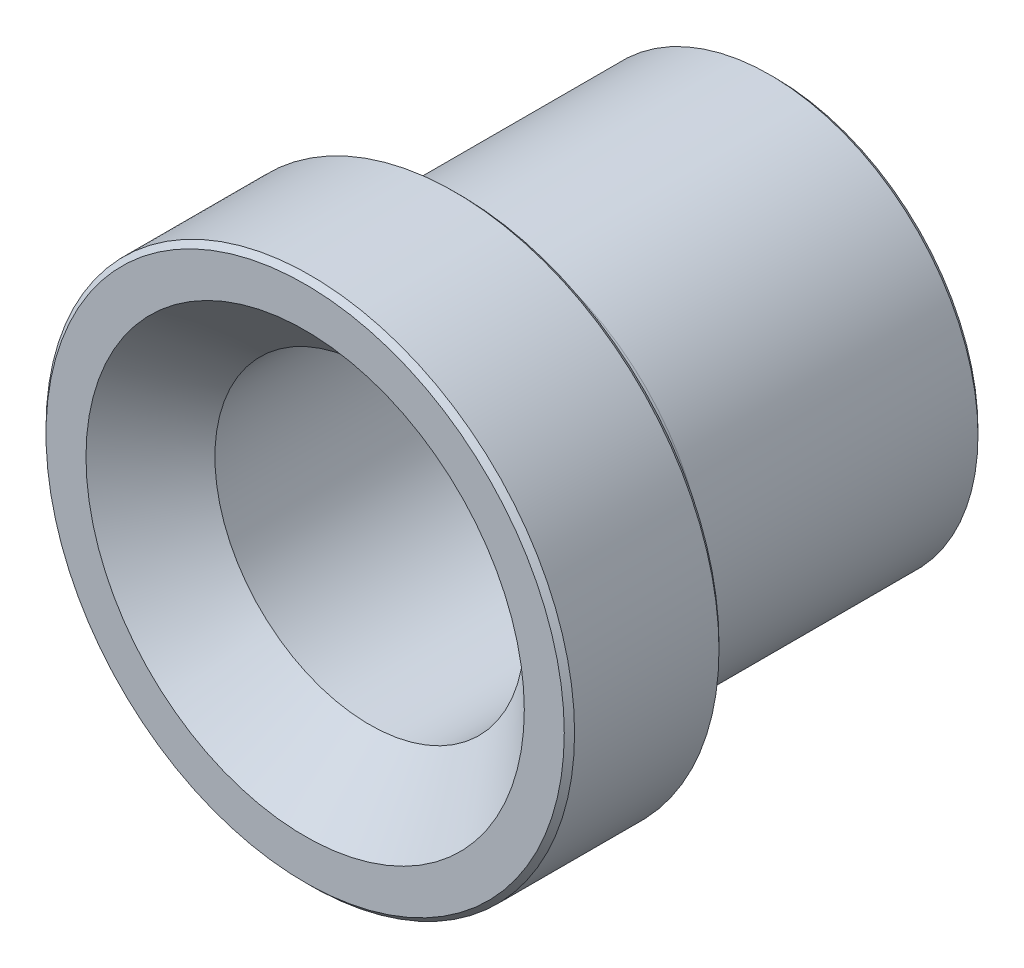
ISO-10303-21;
HEADER;
FILE_DESCRIPTION(('STEP AP214'),'2;1');
FILE_NAME('part.step','',(''),(''),'','','');
FILE_SCHEMA(('AUTOMOTIVE_DESIGN { 1 0 10303 214 1 1 1 1 }'));
ENDSEC;
DATA;
#1=APPLICATION_CONTEXT('core data for automotive mechanical design processes');
#2=APPLICATION_PROTOCOL_DEFINITION('international standard','automotive_design',2000,#1);
#3=PRODUCT_CONTEXT('',#1,'mechanical');
#4=PRODUCT('Part','Part','',(#3));
#5=PRODUCT_RELATED_PRODUCT_CATEGORY('part','',(#4));
#6=PRODUCT_DEFINITION_FORMATION('','',#4);
#7=PRODUCT_DEFINITION_CONTEXT('part definition',#1,'design');
#8=PRODUCT_DEFINITION('design','',#6,#7);
#9=PRODUCT_DEFINITION_SHAPE('','',#8);
#10=(LENGTH_UNIT() NAMED_UNIT(*) SI_UNIT(.MILLI.,.METRE.));
#11=(NAMED_UNIT(*) PLANE_ANGLE_UNIT() SI_UNIT($,.RADIAN.));
#12=(NAMED_UNIT(*) SI_UNIT($,.STERADIAN.) SOLID_ANGLE_UNIT());
#13=UNCERTAINTY_MEASURE_WITH_UNIT(LENGTH_MEASURE(1.E-05),#10,'distance_accuracy_value','');
#14=(GEOMETRIC_REPRESENTATION_CONTEXT(3) GLOBAL_UNCERTAINTY_ASSIGNED_CONTEXT((#13)) GLOBAL_UNIT_ASSIGNED_CONTEXT((#10,
#11,#12)) REPRESENTATION_CONTEXT('',''));
#15=CARTESIAN_POINT('',(0.,0.,0.));
#16=DIRECTION('',(0.,0.,1.));
#17=DIRECTION('',(1.,0.,0.));
#18=AXIS2_PLACEMENT_3D('',#15,#16,#17);
#19=CARTESIAN_POINT('',(0.,0.,0.));
#20=DIRECTION('',(0.,0.,1.));
#21=DIRECTION('',(1.,0.,0.));
#22=AXIS2_PLACEMENT_3D('',#19,#20,#21);
#23=CONICAL_SURFACE('',#22,8.49999999999997,0.785398163397443);
#24=CARTESIAN_POINT('',(0.,0.,-2.5));
#25=DIRECTION('',(0.,0.,1.));
#26=DIRECTION('',(1.,0.,0.));
#27=AXIS2_PLACEMENT_3D('',#24,#25,#26);
#28=CIRCLE('',#27,6.);
#29=CARTESIAN_POINT('',(6.,0.,-2.5));
#30=VERTEX_POINT('',#29);
#31=EDGE_CURVE('E121',#30,#30,#28,.T.);
#32=ORIENTED_EDGE('',*,*,#31,.F.);
#33=EDGE_LOOP('',(#32));
#34=FACE_BOUND('',#33,.T.);
#35=CARTESIAN_POINT('',(0.,0.,0.));
#36=DIRECTION('',(0.,0.,1.));
#37=DIRECTION('',(1.,0.,0.));
#38=AXIS2_PLACEMENT_3D('',#35,#36,#37);
#39=CIRCLE('',#38,8.49999999999997);
#40=CARTESIAN_POINT('',(8.49999999999997,0.,0.));
#41=VERTEX_POINT('',#40);
#42=EDGE_CURVE('E192',#41,#41,#39,.T.);
#43=ORIENTED_EDGE('',*,*,#42,.T.);
#44=EDGE_LOOP('',(#43));
#45=FACE_BOUND('',#44,.T.);
#46=ADVANCED_FACE('F33',(#34,#45),#23,.F.);
#47=CARTESIAN_POINT('',(0.,0.,0.));
#48=DIRECTION('',(0.,0.,1.));
#49=DIRECTION('',(1.,0.,0.));
#50=AXIS2_PLACEMENT_3D('',#47,#48,#49);
#51=CYLINDRICAL_SURFACE('',#50,6.);
#52=CARTESIAN_POINT('',(0.,0.,-18.03));
#53=DIRECTION('',(0.,0.,1.));
#54=DIRECTION('',(1.,0.,0.));
#55=AXIS2_PLACEMENT_3D('',#52,#53,#54);
#56=CIRCLE('',#55,6.);
#57=CARTESIAN_POINT('',(2.5,-5.45435605731786,-18.03));
#58=VERTEX_POINT('',#57);
#59=CARTESIAN_POINT('',(-2.5,-5.45435605731786,-18.03));
#60=VERTEX_POINT('',#59);
#61=EDGE_CURVE('E113',#58,#60,#56,.T.);
#62=ORIENTED_EDGE('',*,*,#61,.F.);
#63=DIRECTION('',(0.,0.,1.));
#64=VECTOR('',#63,1.);
#65=CARTESIAN_POINT('',(2.5,-5.45435605731786,0.));
#66=LINE('',#65,#64);
#67=CARTESIAN_POINT('',(2.5,-5.45435605731786,-13.23));
#68=VERTEX_POINT('',#67);
#69=EDGE_CURVE('E55',#58,#68,#66,.T.);
#70=ORIENTED_EDGE('',*,*,#69,.T.);
#71=CARTESIAN_POINT('',(0.,0.,-13.23));
#72=DIRECTION('',(0.,0.,1.));
#73=DIRECTION('',(1.,0.,0.));
#74=AXIS2_PLACEMENT_3D('',#71,#72,#73);
#75=CIRCLE('',#74,6.);
#76=CARTESIAN_POINT('',(-2.5,-5.45435605731786,-13.23));
#77=VERTEX_POINT('',#76);
#78=EDGE_CURVE('E131',#68,#77,#75,.F.);
#79=ORIENTED_EDGE('',*,*,#78,.T.);
#80=DIRECTION('',(0.,0.,1.));
#81=VECTOR('',#80,1.);
#82=CARTESIAN_POINT('',(-2.5,-5.45435605731786,0.));
#83=LINE('',#82,#81);
#84=EDGE_CURVE('E335',#77,#60,#83,.F.);
#85=ORIENTED_EDGE('',*,*,#84,.T.);
#86=EDGE_LOOP('',(#62,#70,#79,#85));
#87=FACE_BOUND('',#86,.T.);
#88=ORIENTED_EDGE('',*,*,#31,.T.);
#89=EDGE_LOOP('',(#88));
#90=FACE_BOUND('',#89,.T.);
#91=ADVANCED_FACE('F176',(#87,#90),#51,.F.);
#92=CARTESIAN_POINT('',(0.,0.,-18.03));
#93=DIRECTION('',(0.,0.,-1.));
#94=DIRECTION('',(-1.,0.,0.));
#95=AXIS2_PLACEMENT_3D('',#92,#93,#94);
#96=CONICAL_SURFACE('',#95,6.,0.78539816339745);
#97=CARTESIAN_POINT('',(0.,0.,-18.23));
#98=DIRECTION('',(0.,0.,1.));
#99=DIRECTION('',(1.,0.,0.));
#100=AXIS2_PLACEMENT_3D('',#97,#98,#99);
#101=CIRCLE('',#100,6.2);
#102=CARTESIAN_POINT('',(2.5,-5.67362318100171,-18.23));
#103=VERTEX_POINT('',#102);
#104=CARTESIAN_POINT('',(-2.5,-5.67362318100171,-18.23));
#105=VERTEX_POINT('',#104);
#106=EDGE_CURVE('E105',#103,#105,#101,.T.);
#107=ORIENTED_EDGE('',*,*,#106,.F.);
#108=CARTESIAN_POINT('',(2.5,-9.60201867180764,-21.952134980625));
#109=CARTESIAN_POINT('',(2.5,-9.38178344013781,-21.7390176101832));
#110=CARTESIAN_POINT('',(2.5,-9.16132708595419,-21.5261279769551));
#111=CARTESIAN_POINT('',(2.5,-8.71983797789744,-21.1009413673837));
#112=CARTESIAN_POINT('',(2.5,-8.49880521627898,-20.8886443990843));
#113=CARTESIAN_POINT('',(2.5,-8.05591560370238,-20.4646716923838));
#114=CARTESIAN_POINT('',(2.5,-7.83405837237561,-20.2529963510818));
#115=CARTESIAN_POINT('',(2.5,-7.38945123177838,-19.8305876633484));
#116=CARTESIAN_POINT('',(2.5,-7.16670132870748,-19.6198543103964));
#117=CARTESIAN_POINT('',(2.5,-6.72491880861437,-19.2041934915301));
#118=CARTESIAN_POINT('',(2.5,-6.50591105061917,-18.9992396266231));
#119=CARTESIAN_POINT('',(2.5,-6.06645173358816,-18.5908862403918));
#120=CARTESIAN_POINT('',(2.5,-5.84600018449974,-18.3874867083795));
#121=CARTESIAN_POINT('',(2.5,-5.4032032732409,-17.9828576587131));
#122=CARTESIAN_POINT('',(2.5,-5.18085835060763,-17.7816276607373));
#123=CARTESIAN_POINT('',(2.5,-4.73349173766885,-17.3821706835744));
#124=CARTESIAN_POINT('',(2.5,-4.50847016384468,-17.1839435745561));
#125=CARTESIAN_POINT('',(2.5,-4.14539278370891,-16.8704143312728));
#126=CARTESIAN_POINT('',(2.5,-4.00857749722596,-16.753677550874));
#127=CARTESIAN_POINT('',(2.5,-3.73315237186513,-16.5223075487719));
#128=CARTESIAN_POINT('',(2.5,-3.59454235935174,-16.4076745332358));
#129=CARTESIAN_POINT('',(2.5,-3.31344710953752,-16.1799463167894));
#130=CARTESIAN_POINT('',(2.5,-3.17093577292817,-16.066883177379));
#131=CARTESIAN_POINT('',(2.5,-2.88286131021967,-15.8447700960094));
#132=CARTESIAN_POINT('',(2.5,-2.73729891217652,-15.7357192133642));
#133=CARTESIAN_POINT('',(2.5,-2.43972307700173,-15.5216103031246));
#134=CARTESIAN_POINT('',(2.5,-2.28764425138712,-15.4166417914498));
#135=CARTESIAN_POINT('',(2.5,-2.05509848851296,-15.2657351168571));
#136=CARTESIAN_POINT('',(2.5,-1.97678260345741,-15.216488117703));
#137=CARTESIAN_POINT('',(2.5,-1.81847720816471,-15.1207721955223));
#138=CARTESIAN_POINT('',(2.5,-1.73848789448753,-15.0743029486684));
#139=CARTESIAN_POINT('',(2.5,-1.57766156326313,-14.9854342304328));
#140=CARTESIAN_POINT('',(2.5,-1.49685058423034,-14.9429882706989));
#141=CARTESIAN_POINT('',(2.5,-1.33314685448077,-14.8623477070864));
#142=CARTESIAN_POINT('',(2.5,-1.25025373392203,-14.8241538651325));
#143=CARTESIAN_POINT('',(2.5,-0.998559756703421,-14.7177704753816));
#144=CARTESIAN_POINT('',(2.5,-0.826135699052493,-14.6574250215428));
#145=CARTESIAN_POINT('',(2.5,-0.567515720782905,-14.5923694220285));
#146=CARTESIAN_POINT('',(2.5,-0.484428053203151,-14.5751566599229));
#147=CARTESIAN_POINT('',(2.5,-0.316968107841335,-14.5486596680996));
#148=CARTESIAN_POINT('',(2.5,-0.232595933495816,-14.5393748033792));
#149=CARTESIAN_POINT('',(2.5,-0.0635545293498249,-14.5293880219311));
#150=CARTESIAN_POINT('',(2.5,0.0211133903774137,-14.528664232716));
#151=CARTESIAN_POINT('',(2.5,0.190087555037353,-14.5357943632657));
#152=CARTESIAN_POINT('',(2.5,0.27439377056234,-14.5436489676941));
#153=CARTESIAN_POINT('',(2.5,0.440806929168448,-14.5672431504869));
#154=CARTESIAN_POINT('',(2.5,0.522928178726345,-14.5828838636708));
#155=CARTESIAN_POINT('',(2.5,0.685529631146964,-14.6210805876454));
#156=CARTESIAN_POINT('',(2.5,0.766009641930485,-14.6436374029513));
#157=CARTESIAN_POINT('',(2.5,0.926069634724629,-14.6949164939594));
#158=CARTESIAN_POINT('',(2.5,1.0056256828142,-14.7237125219922));
#159=CARTESIAN_POINT('',(2.5,1.16274051512552,-14.7862243540705));
#160=CARTESIAN_POINT('',(2.5,1.24029964456728,-14.8199393009411));
#161=CARTESIAN_POINT('',(2.5,1.43120252182423,-14.908905371106));
#162=CARTESIAN_POINT('',(2.5,1.54340353730981,-14.9665984386099));
#163=CARTESIAN_POINT('',(2.5,1.76426358278963,-15.0884546700202));
#164=CARTESIAN_POINT('',(2.5,1.87292033468577,-15.1526218908616));
#165=CARTESIAN_POINT('',(2.5,2.08762998650616,-15.2859327102484));
#166=CARTESIAN_POINT('',(2.5,2.19367271981472,-15.3550925646662));
#167=CARTESIAN_POINT('',(2.5,2.40329683493631,-15.4969711190836));
#168=CARTESIAN_POINT('',(2.5,2.50687879403119,-15.5696889719044));
#169=CARTESIAN_POINT('',(2.5,2.70530044646612,-15.7129691071883));
#170=CARTESIAN_POINT('',(2.5,2.80026630681598,-15.7833574732081));
#171=CARTESIAN_POINT('',(2.5,2.98877666007147,-15.9260227939486));
#172=CARTESIAN_POINT('',(2.5,3.08232104094107,-15.9982998963245));
#173=CARTESIAN_POINT('',(2.5,3.26747276809047,-16.143771702127));
#174=CARTESIAN_POINT('',(2.5,3.35908965284987,-16.2169542999138));
#175=CARTESIAN_POINT('',(2.5,3.54131705134436,-16.3645251877744));
#176=CARTESIAN_POINT('',(2.5,3.63192776727352,-16.4389132279398));
#177=CARTESIAN_POINT('',(2.5,3.722134980625,-16.5137806384782));
#178=B_SPLINE_CURVE_WITH_KNOTS('',3,(#108,#109,#110,#111,#112,#113,#114,#115,#116,#117,#118,
#119,#120,#121,#122,#123,#124,#125,#126,#127,#128,#129,#130,#131,#132,#133,#134,#135,#136,#137,
#138,#139,#140,#141,#142,#143,#144,#145,#146,#147,#148,#149,#150,#151,#152,#153,#154,#155,#156,
#157,#158,#159,#160,#161,#162,#163,#164,#165,#166,#167,#168,#169,#170,#171,#172,#173,#174,#175,
#176,#177),.UNSPECIFIED.,.F.,.F.,(4,2,2,2,2,2,2,2,2,2,2,2,2,2,2,2,2,2,2,2,2,2,2,2,2,2,2,2,2,2,2,
2,2,2,4),(0.,0.919404326288802,1.8388210711597,2.7587340082391,3.67864056760311,
4.57848761028734,5.47832845973746,6.3779658207482,7.27756417392985,7.8170973391364,
8.35668309883595,8.90237227991235,9.44793269647305,10.0020545968718,10.2795480269275,
10.5570090437583,10.8307228185219,11.1044855605964,11.6499085198415,11.9041518155781,
12.1583747452171,12.4119480260451,12.6655415466819,12.9159941554326,13.1664759091292,
13.4200980130424,13.6736759732214,14.0518545157696,14.4302715279117,14.809981657624,
15.1896018121222,15.5441963788214,15.8988187499609,16.250580414396,16.6022700627391),.UNSPECIFIED.);
#179=EDGE_CURVE('E167',#103,#58,#178,.T.);
#180=ORIENTED_EDGE('',*,*,#179,.T.);
#181=ORIENTED_EDGE('',*,*,#61,.T.);
#182=CARTESIAN_POINT('',(-2.5,3.722134980625,-16.5137806384782));
#183=CARTESIAN_POINT('',(-2.5,3.65848993931883,-16.4609491345056));
#184=CARTESIAN_POINT('',(-2.5,3.59464051605015,-16.4083640576587));
#185=CARTESIAN_POINT('',(-2.5,3.46647350947901,-16.3037646561941));
#186=CARTESIAN_POINT('',(-2.5,3.4021559150451,-16.2517503452213));
#187=CARTESIAN_POINT('',(-2.5,3.20828908638222,-16.0965823247877));
#188=CARTESIAN_POINT('',(-2.5,3.07795099612,-15.994407950408));
#189=CARTESIAN_POINT('',(-2.5,2.81160467899573,-15.7913193312205));
#190=CARTESIAN_POINT('',(-2.5,2.67553487016269,-15.6904855244798));
#191=CARTESIAN_POINT('',(-2.5,2.39973748707489,-15.4940067049654));
#192=CARTESIAN_POINT('',(-2.5,2.26001138657893,-15.3983596478886));
#193=CARTESIAN_POINT('',(-2.5,2.01687142405552,-15.2412085175084));
#194=CARTESIAN_POINT('',(-2.5,1.91466736191286,-15.1778418350115));
#195=CARTESIAN_POINT('',(-2.5,1.70729014831226,-15.0561824770022));
#196=CARTESIAN_POINT('',(-2.5,1.60211786265328,-14.9978883417317));
#197=CARTESIAN_POINT('',(-2.5,1.38878604120381,-14.8883888546538));
#198=CARTESIAN_POINT('',(-2.5,1.28064456052844,-14.8371487310442));
#199=CARTESIAN_POINT('',(-2.5,1.06048322475904,-14.7438003964576));
#200=CARTESIAN_POINT('',(-2.5,0.948466381802272,-14.7016852700974));
#201=CARTESIAN_POINT('',(-2.5,0.761527110027135,-14.6424954328919));
#202=CARTESIAN_POINT('',(-2.5,0.687734045698106,-14.6218601834108));
#203=CARTESIAN_POINT('',(-2.5,0.538780548102494,-14.5863762178713));
#204=CARTESIAN_POINT('',(-2.5,0.4636207192134,-14.5715250062743));
#205=CARTESIAN_POINT('',(-2.5,0.312549886268916,-14.548360438496));
#206=CARTESIAN_POINT('',(-2.5,0.236642342967694,-14.5400248323182));
#207=CARTESIAN_POINT('',(-2.5,0.0843791360589929,-14.5302700481991));
#208=CARTESIAN_POINT('',(-2.5,0.00802348862828913,-14.5288506220994));
#209=CARTESIAN_POINT('',(-2.5,-0.144590032888433,-14.5330140710885));
#210=CARTESIAN_POINT('',(-2.5,-0.220847661800396,-14.5386057896037));
#211=CARTESIAN_POINT('',(-2.5,-0.372566251731125,-14.5564850806912));
#212=CARTESIAN_POINT('',(-2.5,-0.448027151643238,-14.5687731631054));
#213=CARTESIAN_POINT('',(-2.5,-0.597981156660188,-14.5994685357518));
#214=CARTESIAN_POINT('',(-2.5,-0.672469407864158,-14.6178992392361));
#215=CARTESIAN_POINT('',(-2.5,-0.819905552636732,-14.6600680873935));
#216=CARTESIAN_POINT('',(-2.5,-0.892853377259965,-14.6838064690754));
#217=CARTESIAN_POINT('',(-2.5,-1.13387656236154,-14.770579898383));
#218=CARTESIAN_POINT('',(-2.5,-1.29836699505776,-14.8436307023741));
#219=CARTESIAN_POINT('',(-2.5,-1.53902693014698,-14.9649314139596));
#220=CARTESIAN_POINT('',(-2.5,-1.61832655652085,-15.0073775616382));
#221=CARTESIAN_POINT('',(-2.5,-1.77514853504791,-15.0954424090945));
#222=CARTESIAN_POINT('',(-2.5,-1.85267119392129,-15.1410605557902));
#223=CARTESIAN_POINT('',(-2.5,-2.00725096664921,-15.2355048389876));
#224=CARTESIAN_POINT('',(-2.5,-2.08428547142144,-15.2843675915175));
#225=CARTESIAN_POINT('',(-2.5,-2.23697196029238,-15.384207579464));
#226=CARTESIAN_POINT('',(-2.5,-2.31262390663195,-15.4351848725069));
#227=CARTESIAN_POINT('',(-2.5,-2.46265425662106,-15.5388068496912));
#228=CARTESIAN_POINT('',(-2.5,-2.537033928538,-15.5914497038316));
#229=CARTESIAN_POINT('',(-2.5,-2.68476248024451,-15.6981531712497));
#230=CARTESIAN_POINT('',(-2.5,-2.75811139691628,-15.7522137336));
#231=CARTESIAN_POINT('',(-2.5,-2.9925756982025,-15.9279499903612));
#232=CARTESIAN_POINT('',(-2.5,-3.15197208859971,-16.0519191377602));
#233=CARTESIAN_POINT('',(-2.5,-3.4676233678881,-16.3038053037576));
#234=CARTESIAN_POINT('',(-2.5,-3.62387779896014,-16.4317228909025));
#235=CARTESIAN_POINT('',(-2.5,-3.93408636358336,-16.6904414358777));
#236=CARTESIAN_POINT('',(-2.5,-4.08803950625923,-16.8212435789472));
#237=CARTESIAN_POINT('',(-2.5,-4.39414275823491,-17.0849443111645));
#238=CARTESIAN_POINT('',(-2.5,-4.54629281052991,-17.2178429662857));
#239=CARTESIAN_POINT('',(-2.5,-4.84950026874218,-17.4855083655877));
#240=CARTESIAN_POINT('',(-2.5,-5.00055475536371,-17.6202784115143));
#241=CARTESIAN_POINT('',(-2.5,-5.30154416095175,-17.8910639587791));
#242=CARTESIAN_POINT('',(-2.5,-5.45147906933453,-18.0270794718641));
#243=CARTESIAN_POINT('',(-2.5,-5.8998657770775,-18.4365174455164));
#244=CARTESIAN_POINT('',(-2.5,-6.19698062130841,-18.711403442285));
#245=CARTESIAN_POINT('',(-2.5,-6.75511500656349,-19.2322779234912));
#246=CARTESIAN_POINT('',(-2.5,-7.01639158045146,-19.4779920129401));
#247=CARTESIAN_POINT('',(-2.5,-7.53758016008937,-19.9709031202078));
#248=CARTESIAN_POINT('',(-2.5,-7.79749205822686,-20.2181002517751));
#249=CARTESIAN_POINT('',(-2.5,-8.31530185205489,-20.7126474379361));
#250=CARTESIAN_POINT('',(-2.5,-8.57320364607079,-20.9599934156622));
#251=CARTESIAN_POINT('',(-2.5,-9.08817449756922,-21.4555037963273));
#252=CARTESIAN_POINT('',(-2.5,-9.34524362925946,-21.7036681221209));
#253=CARTESIAN_POINT('',(-2.5,-9.60201867180764,-21.952134980625));
#254=B_SPLINE_CURVE_WITH_KNOTS('',3,(#182,#183,#184,#185,#186,#187,#188,#189,#190,#191,#192,
#193,#194,#195,#196,#197,#198,#199,#200,#201,#202,#203,#204,#205,#206,#207,#208,#209,#210,#211,
#212,#213,#214,#215,#216,#217,#218,#219,#220,#221,#222,#223,#224,#225,#226,#227,#228,#229,#230,
#231,#232,#233,#234,#235,#236,#237,#238,#239,#240,#241,#242,#243,#244,#245,#246,#247,#248,#249,
#250,#251,#252,#253),.UNSPECIFIED.,.F.,.F.,(4,2,2,2,2,2,2,2,2,2,2,2,2,2,2,2,2,2,2,2,2,2,2,2,2,2,
2,2,2,2,2,2,2,2,2,4),(0.,0.248145226863179,0.496296373134759,0.993087658807286,1.50108719297573,
2.00888502703471,2.36954210005639,2.73009503894445,3.08880164817186,3.44723545314548,
3.67691367800884,3.90649269751843,4.13528426543548,4.36406762406022,4.59313984644889,
4.82222951217456,5.05220255887005,5.28218587682064,5.82050877985799,6.09032403710168,
6.36009236571004,6.63372834420746,6.90737178486163,7.18072434847323,7.45406710602758,
8.05975001834081,8.66552055519226,9.27154481483483,9.8775881831273,10.4848880203154,
11.0921935912492,12.3064792969289,13.3824698210326,14.4585439557946,15.5305682543362,
16.6024942285322),.UNSPECIFIED.);
#255=EDGE_CURVE('E95',#60,#105,#254,.T.);
#256=ORIENTED_EDGE('',*,*,#255,.T.);
#257=EDGE_LOOP('',(#107,#180,#181,#256));
#258=FACE_BOUND('',#257,.T.);
#259=ADVANCED_FACE('F173',(#258),#96,.F.);
#260=CARTESIAN_POINT('',(0.,7.865,-18.23));
#261=DIRECTION('',(0.,0.,1.));
#262=DIRECTION('',(1.,0.,0.));
#263=AXIS2_PLACEMENT_3D('',#260,#261,#262);
#264=PLANE('',#263);
#265=CARTESIAN_POINT('',(0.,0.,-18.23));
#266=DIRECTION('',(0.,0.,1.));
#267=DIRECTION('',(1.,0.,0.));
#268=AXIS2_PLACEMENT_3D('',#265,#266,#267);
#269=CIRCLE('',#268,7.865);
#270=CARTESIAN_POINT('',(2.5,-7.45709226173312,-18.23));
#271=VERTEX_POINT('',#270);
#272=CARTESIAN_POINT('',(-2.5,-7.45709226173312,-18.23));
#273=VERTEX_POINT('',#272);
#274=EDGE_CURVE('E103',#271,#273,#269,.T.);
#275=ORIENTED_EDGE('',*,*,#274,.F.);
#276=DIRECTION('',(0.,1.,0.));
#277=VECTOR('',#276,1.);
#278=CARTESIAN_POINT('',(2.5,-10.25,-18.23));
#279=LINE('',#278,#277);
#280=EDGE_CURVE('E106',#271,#103,#279,.T.);
#281=ORIENTED_EDGE('',*,*,#280,.T.);
#282=ORIENTED_EDGE('',*,*,#106,.T.);
#283=DIRECTION('',(0.,1.,0.));
#284=VECTOR('',#283,1.);
#285=CARTESIAN_POINT('',(-2.5,-10.25,-18.23));
#286=LINE('',#285,#284);
#287=EDGE_CURVE('E87',#273,#105,#286,.T.);
#288=ORIENTED_EDGE('',*,*,#287,.F.);
#289=EDGE_LOOP('',(#275,#281,#282,#288));
#290=FACE_BOUND('',#289,.T.);
#291=ADVANCED_FACE('F101',(#290),#264,.F.);
#292=CARTESIAN_POINT('',(0.,0.,-18.23));
#293=DIRECTION('',(0.,0.,1.));
#294=DIRECTION('',(1.,0.,0.));
#295=AXIS2_PLACEMENT_3D('',#292,#293,#294);
#296=CONICAL_SURFACE('',#295,7.865,0.785398163397461);
#297=CARTESIAN_POINT('',(0.,0.,-18.03));
#298=DIRECTION('',(0.,0.,1.));
#299=DIRECTION('',(1.,0.,0.));
#300=AXIS2_PLACEMENT_3D('',#297,#298,#299);
#301=CIRCLE('',#300,8.065);
#302=CARTESIAN_POINT('',(2.5,-7.66773923656771,-18.03));
#303=VERTEX_POINT('',#302);
#304=CARTESIAN_POINT('',(-2.5,-7.66773923656771,-18.03));
#305=VERTEX_POINT('',#304);
#306=EDGE_CURVE('E111',#303,#305,#301,.T.);
#307=ORIENTED_EDGE('',*,*,#306,.F.);
#308=CARTESIAN_POINT('',(2.5,-13.7797578488347,-12.0902962768748));
#309=CARTESIAN_POINT('',(2.5,-13.5113488134894,-12.3543908858419));
#310=CARTESIAN_POINT('',(2.5,-13.2428201817694,-12.6183640232949));
#311=CARTESIAN_POINT('',(2.5,-12.7054681180871,-13.1460108054376));
#312=CARTESIAN_POINT('',(2.5,-12.4366446857134,-13.4096844497084));
#313=CARTESIAN_POINT('',(2.5,-11.6296337745315,-14.2001860084577));
#314=CARTESIAN_POINT('',(2.5,-11.0909217668481,-14.7264787088999));
#315=CARTESIAN_POINT('',(2.5,-10.0115870781266,-15.7767539043933));
#316=CARTESIAN_POINT('',(2.5,-9.47096507459353,-16.3007370943539));
#317=CARTESIAN_POINT('',(2.5,-8.65748820250105,-17.0840702934807));
#318=CARTESIAN_POINT('',(2.5,-8.3859054737878,-17.3447408993223));
#319=CARTESIAN_POINT('',(2.5,-7.8416152751804,-17.8649048741537));
#320=CARTESIAN_POINT('',(2.5,-7.56890780860605,-18.1243982466134));
#321=CARTESIAN_POINT('',(2.5,-7.0534295002637,-18.6120377228495));
#322=CARTESIAN_POINT('',(2.5,-6.81082252306225,-18.840356945238));
#323=CARTESIAN_POINT('',(2.5,-6.32403513269441,-19.2953025994541));
#324=CARTESIAN_POINT('',(2.5,-6.07985476164452,-19.5219290762452));
#325=CARTESIAN_POINT('',(2.5,-5.71193202835371,-19.8601099844292));
#326=CARTESIAN_POINT('',(2.5,-5.58900607614358,-19.9725525443497));
#327=CARTESIAN_POINT('',(2.5,-5.34250280791279,-20.1967200865589));
#328=CARTESIAN_POINT('',(2.5,-5.21892549652992,-20.3084450739443));
#329=CARTESIAN_POINT('',(2.5,-4.97098218096828,-20.531038705496));
#330=CARTESIAN_POINT('',(2.5,-4.84661611169343,-20.6419072772626));
#331=CARTESIAN_POINT('',(2.5,-4.59692587023536,-20.8625658211235));
#332=CARTESIAN_POINT('',(2.5,-4.47160167464571,-20.9723557667168));
#333=CARTESIAN_POINT('',(2.5,-4.34571163358464,-21.0814972721386));
#334=B_SPLINE_CURVE_WITH_KNOTS('',3,(#308,#309,#310,#311,#312,#313,#314,#315,#316,#317,#318,
#319,#320,#321,#322,#323,#324,#325,#326,#327,#328,#329,#330,#331,#332,#333),.UNSPECIFIED.,.F.,
.F.,(4,2,2,2,2,2,2,2,2,2,2,2,4),(0.,1.12964791468425,2.25929740778831,4.51866411928122,
6.77729690152038,7.9066115836969,9.03592293495501,10.0353627859373,11.0347759942043,
11.5345607780427,12.0343420081214,12.5341650362064,13.0340003139306),.UNSPECIFIED.);
#335=EDGE_CURVE('E110',#303,#271,#334,.T.);
#336=ORIENTED_EDGE('',*,*,#335,.T.);
#337=ORIENTED_EDGE('',*,*,#274,.T.);
#338=CARTESIAN_POINT('',(-2.5,-4.34571163358464,-21.0814972721386));
#339=CARTESIAN_POINT('',(-2.5,-4.47160167464571,-20.9723557667168));
#340=CARTESIAN_POINT('',(-2.5,-4.59692587023537,-20.8625658211235));
#341=CARTESIAN_POINT('',(-2.5,-4.84661611169343,-20.6419072772626));
#342=CARTESIAN_POINT('',(-2.5,-4.97098218096828,-20.531038705496));
#343=CARTESIAN_POINT('',(-2.5,-5.21892549652992,-20.3084450739443));
#344=CARTESIAN_POINT('',(-2.5,-5.34250280791279,-20.196720086559));
#345=CARTESIAN_POINT('',(-2.5,-5.58900607614358,-19.9725525443497));
#346=CARTESIAN_POINT('',(-2.5,-5.71193202835371,-19.8601099844292));
#347=CARTESIAN_POINT('',(-2.5,-6.07985476164452,-19.5219290762452));
#348=CARTESIAN_POINT('',(-2.5,-6.32403513269441,-19.2953025994541));
#349=CARTESIAN_POINT('',(-2.5,-6.81082252306225,-18.840356945238));
#350=CARTESIAN_POINT('',(-2.5,-7.05342950026369,-18.6120377228495));
#351=CARTESIAN_POINT('',(-2.5,-7.56890780860605,-18.1243982466134));
#352=CARTESIAN_POINT('',(-2.5,-7.8416152751804,-17.8649048741537));
#353=CARTESIAN_POINT('',(-2.5,-8.3859054737878,-17.3447408993223));
#354=CARTESIAN_POINT('',(-2.5,-8.65748820250105,-17.0840702934807));
#355=CARTESIAN_POINT('',(-2.5,-9.47096507459352,-16.3007370943539));
#356=CARTESIAN_POINT('',(-2.5,-10.0115870781266,-15.7767539043933));
#357=CARTESIAN_POINT('',(-2.5,-11.0909217668481,-14.7264787088999));
#358=CARTESIAN_POINT('',(-2.5,-11.6296337745315,-14.2001860084577));
#359=CARTESIAN_POINT('',(-2.5,-12.4366446857134,-13.4096844497084));
#360=CARTESIAN_POINT('',(-2.5,-12.7054681180871,-13.1460108054376));
#361=CARTESIAN_POINT('',(-2.5,-13.2428201817694,-12.6183640232949));
#362=CARTESIAN_POINT('',(-2.5,-13.5113488134894,-12.3543908858419));
#363=CARTESIAN_POINT('',(-2.5,-13.7797578488347,-12.0902962768748));
#364=B_SPLINE_CURVE_WITH_KNOTS('',3,(#338,#339,#340,#341,#342,#343,#344,#345,#346,#347,#348,
#349,#350,#351,#352,#353,#354,#355,#356,#357,#358,#359,#360,#361,#362,#363),.UNSPECIFIED.,.F.,
.F.,(4,2,2,2,2,2,2,2,2,2,2,2,4),(0.,0.499835277724189,0.999658305809207,1.49943953588784,
1.99922431972623,2.99863752799325,3.99807737897555,5.12738873023366,6.25670341241018,
8.51533619464934,10.7747029061422,11.9043523992463,13.0340003139306),.UNSPECIFIED.);
#365=EDGE_CURVE('E84',#273,#305,#364,.T.);
#366=ORIENTED_EDGE('',*,*,#365,.T.);
#367=EDGE_LOOP('',(#307,#336,#337,#366));
#368=FACE_BOUND('',#367,.T.);
#369=ADVANCED_FACE('F109',(#368),#296,.T.);
#370=CARTESIAN_POINT('',(0.,0.,0.));
#371=DIRECTION('',(0.,0.,1.));
#372=DIRECTION('',(1.,0.,0.));
#373=AXIS2_PLACEMENT_3D('',#370,#371,#372);
#374=CYLINDRICAL_SURFACE('',#373,8.065);
#375=CARTESIAN_POINT('',(0.,0.,-7.5));
#376=DIRECTION('',(0.,0.,1.));
#377=DIRECTION('',(1.,0.,0.));
#378=AXIS2_PLACEMENT_3D('',#375,#376,#377);
#379=CIRCLE('',#378,8.065);
#380=CARTESIAN_POINT('',(8.065,0.,-7.5));
#381=VERTEX_POINT('',#380);
#382=EDGE_CURVE('E115',#381,#381,#379,.T.);
#383=ORIENTED_EDGE('',*,*,#382,.F.);
#384=EDGE_LOOP('',(#383));
#385=FACE_BOUND('',#384,.T.);
#386=CARTESIAN_POINT('',(0.,0.,-13.23));
#387=DIRECTION('',(0.,0.,1.));
#388=DIRECTION('',(1.,0.,0.));
#389=AXIS2_PLACEMENT_3D('',#386,#387,#388);
#390=CIRCLE('',#389,8.065);
#391=CARTESIAN_POINT('',(-2.5,-7.66773923656771,-13.23));
#392=VERTEX_POINT('',#391);
#393=CARTESIAN_POINT('',(2.5,-7.66773923656771,-13.23));
#394=VERTEX_POINT('',#393);
#395=EDGE_CURVE('E40',#392,#394,#390,.T.);
#396=ORIENTED_EDGE('',*,*,#395,.T.);
#397=DIRECTION('',(0.,0.,1.));
#398=VECTOR('',#397,1.);
#399=CARTESIAN_POINT('',(2.5,-7.66773923656771,0.));
#400=LINE('',#399,#398);
#401=EDGE_CURVE('E11',#394,#303,#400,.F.);
#402=ORIENTED_EDGE('',*,*,#401,.T.);
#403=ORIENTED_EDGE('',*,*,#306,.T.);
#404=DIRECTION('',(0.,0.,1.));
#405=VECTOR('',#404,1.);
#406=CARTESIAN_POINT('',(-2.5,-7.66773923656771,0.));
#407=LINE('',#406,#405);
#408=EDGE_CURVE('E90',#305,#392,#407,.T.);
#409=ORIENTED_EDGE('',*,*,#408,.T.);
#410=EDGE_LOOP('',(#396,#402,#403,#409));
#411=FACE_BOUND('',#410,.T.);
#412=ADVANCED_FACE('F126',(#385,#411),#374,.T.);
#413=CARTESIAN_POINT('',(0.,0.,-7.5));
#414=DIRECTION('',(0.,0.,1.));
#415=DIRECTION('',(1.,0.,0.));
#416=AXIS2_PLACEMENT_3D('',#413,#414,#415);
#417=TOROIDAL_SURFACE('',#416,9.565,1.5);
#418=CARTESIAN_POINT('',(0.,0.,-6.));
#419=DIRECTION('',(0.,0.,1.));
#420=DIRECTION('',(1.,0.,0.));
#421=AXIS2_PLACEMENT_3D('',#418,#419,#420);
#422=CIRCLE('',#421,9.565);
#423=CARTESIAN_POINT('',(9.565,0.,-6.));
#424=VERTEX_POINT('',#423);
#425=EDGE_CURVE('E207',#424,#424,#422,.T.);
#426=ORIENTED_EDGE('',*,*,#425,.F.);
#427=EDGE_LOOP('',(#426));
#428=FACE_BOUND('',#427,.T.);
#429=ORIENTED_EDGE('',*,*,#382,.T.);
#430=EDGE_LOOP('',(#429));
#431=FACE_BOUND('',#430,.T.);
#432=ADVANCED_FACE('F212',(#428,#431),#417,.F.);
#433=CARTESIAN_POINT('',(0.,10.05,-6.));
#434=DIRECTION('',(0.,0.,1.));
#435=DIRECTION('',(1.,0.,0.));
#436=AXIS2_PLACEMENT_3D('',#433,#434,#435);
#437=PLANE('',#436);
#438=CARTESIAN_POINT('',(0.,0.,-6.));
#439=DIRECTION('',(0.,0.,1.));
#440=DIRECTION('',(1.,0.,0.));
#441=AXIS2_PLACEMENT_3D('',#438,#439,#440);
#442=CIRCLE('',#441,10.05);
#443=CARTESIAN_POINT('',(10.05,0.,-6.));
#444=VERTEX_POINT('',#443);
#445=EDGE_CURVE('E204',#444,#444,#442,.T.);
#446=ORIENTED_EDGE('',*,*,#445,.F.);
#447=EDGE_LOOP('',(#446));
#448=FACE_BOUND('',#447,.T.);
#449=ORIENTED_EDGE('',*,*,#425,.T.);
#450=EDGE_LOOP('',(#449));
#451=FACE_BOUND('',#450,.T.);
#452=ADVANCED_FACE('F219',(#448,#451),#437,.F.);
#453=CARTESIAN_POINT('',(0.,0.,-6.));
#454=DIRECTION('',(0.,0.,1.));
#455=DIRECTION('',(1.,0.,0.));
#456=AXIS2_PLACEMENT_3D('',#453,#454,#455);
#457=CONICAL_SURFACE('',#456,10.05,0.78539816339745);
#458=CARTESIAN_POINT('',(0.,0.,-5.8));
#459=DIRECTION('',(0.,0.,1.));
#460=DIRECTION('',(1.,0.,0.));
#461=AXIS2_PLACEMENT_3D('',#458,#459,#460);
#462=CIRCLE('',#461,10.25);
#463=CARTESIAN_POINT('',(10.25,0.,-5.8));
#464=VERTEX_POINT('',#463);
#465=EDGE_CURVE('E201',#464,#464,#462,.T.);
#466=ORIENTED_EDGE('',*,*,#465,.F.);
#467=EDGE_LOOP('',(#466));
#468=FACE_BOUND('',#467,.T.);
#469=ORIENTED_EDGE('',*,*,#445,.T.);
#470=EDGE_LOOP('',(#469));
#471=FACE_BOUND('',#470,.T.);
#472=ADVANCED_FACE('F225',(#468,#471),#457,.T.);
#473=CARTESIAN_POINT('',(0.,0.,0.));
#474=DIRECTION('',(0.,0.,1.));
#475=DIRECTION('',(1.,0.,0.));
#476=AXIS2_PLACEMENT_3D('',#473,#474,#475);
#477=CYLINDRICAL_SURFACE('',#476,10.25);
#478=CARTESIAN_POINT('',(0.,0.,-0.2));
#479=DIRECTION('',(0.,0.,1.));
#480=DIRECTION('',(1.,0.,0.));
#481=AXIS2_PLACEMENT_3D('',#478,#479,#480);
#482=CIRCLE('',#481,10.25);
#483=CARTESIAN_POINT('',(10.25,0.,-0.2));
#484=VERTEX_POINT('',#483);
#485=EDGE_CURVE('E196',#484,#484,#482,.T.);
#486=ORIENTED_EDGE('',*,*,#485,.F.);
#487=EDGE_LOOP('',(#486));
#488=FACE_BOUND('',#487,.T.);
#489=ORIENTED_EDGE('',*,*,#465,.T.);
#490=EDGE_LOOP('',(#489));
#491=FACE_BOUND('',#490,.T.);
#492=ADVANCED_FACE('F229',(#488,#491),#477,.T.);
#493=CARTESIAN_POINT('',(0.,0.,-0.2));
#494=DIRECTION('',(0.,0.,-1.));
#495=DIRECTION('',(-1.,0.,0.));
#496=AXIS2_PLACEMENT_3D('',#493,#494,#495);
#497=CONICAL_SURFACE('',#496,10.25,0.78539816339745);
#498=CARTESIAN_POINT('',(0.,0.,0.));
#499=DIRECTION('',(0.,0.,1.));
#500=DIRECTION('',(1.,0.,0.));
#501=AXIS2_PLACEMENT_3D('',#498,#499,#500);
#502=CIRCLE('',#501,10.05);
#503=CARTESIAN_POINT('',(10.05,0.,0.));
#504=VERTEX_POINT('',#503);
#505=EDGE_CURVE('E194',#504,#504,#502,.T.);
#506=ORIENTED_EDGE('',*,*,#505,.F.);
#507=EDGE_LOOP('',(#506));
#508=FACE_BOUND('',#507,.T.);
#509=ORIENTED_EDGE('',*,*,#485,.T.);
#510=EDGE_LOOP('',(#509));
#511=FACE_BOUND('',#510,.T.);
#512=ADVANCED_FACE('F232',(#508,#511),#497,.T.);
#513=CARTESIAN_POINT('',(0.,8.49999999999997,0.));
#514=DIRECTION('',(0.,0.,-1.));
#515=DIRECTION('',(-1.,0.,0.));
#516=AXIS2_PLACEMENT_3D('',#513,#514,#515);
#517=PLANE('',#516);
#518=ORIENTED_EDGE('',*,*,#42,.F.);
#519=EDGE_LOOP('',(#518));
#520=FACE_BOUND('',#519,.T.);
#521=ORIENTED_EDGE('',*,*,#505,.T.);
#522=EDGE_LOOP('',(#521));
#523=FACE_BOUND('',#522,.T.);
#524=ADVANCED_FACE('F158',(#520,#523),#517,.F.);
#525=CARTESIAN_POINT('',(2.5,-10.25,-18.23));
#526=DIRECTION('',(1.,0.,0.));
#527=DIRECTION('',(0.,0.,-1.));
#528=AXIS2_PLACEMENT_3D('',#525,#526,#527);
#529=PLANE('',#528);
#530=ORIENTED_EDGE('',*,*,#179,.F.);
#531=ORIENTED_EDGE('',*,*,#280,.F.);
#532=ORIENTED_EDGE('',*,*,#335,.F.);
#533=ORIENTED_EDGE('',*,*,#401,.F.);
#534=DIRECTION('',(0.,1.,0.));
#535=VECTOR('',#534,1.);
#536=CARTESIAN_POINT('',(2.5,-10.25,-13.23));
#537=LINE('',#536,#535);
#538=EDGE_CURVE('E96',#394,#68,#537,.T.);
#539=ORIENTED_EDGE('',*,*,#538,.T.);
#540=ORIENTED_EDGE('',*,*,#69,.F.);
#541=EDGE_LOOP('',(#530,#531,#532,#533,#539,#540));
#542=FACE_BOUND('',#541,.T.);
#543=ADVANCED_FACE('F153',(#542),#529,.F.);
#544=CARTESIAN_POINT('',(2.5,-10.25,-13.23));
#545=DIRECTION('',(0.,0.,1.));
#546=DIRECTION('',(1.,0.,0.));
#547=AXIS2_PLACEMENT_3D('',#544,#545,#546);
#548=PLANE('',#547);
#549=ORIENTED_EDGE('',*,*,#538,.F.);
#550=ORIENTED_EDGE('',*,*,#395,.F.);
#551=DIRECTION('',(0.,1.,0.));
#552=VECTOR('',#551,1.);
#553=CARTESIAN_POINT('',(-2.5,-10.25,-13.23));
#554=LINE('',#553,#552);
#555=EDGE_CURVE('E47',#392,#77,#554,.T.);
#556=ORIENTED_EDGE('',*,*,#555,.T.);
#557=ORIENTED_EDGE('',*,*,#78,.F.);
#558=EDGE_LOOP('',(#549,#550,#556,#557));
#559=FACE_BOUND('',#558,.T.);
#560=ADVANCED_FACE('F129',(#559),#548,.F.);
#561=CARTESIAN_POINT('',(-2.5,-10.25,-18.23));
#562=DIRECTION('',(-1.,0.,0.));
#563=DIRECTION('',(0.,0.,1.));
#564=AXIS2_PLACEMENT_3D('',#561,#562,#563);
#565=PLANE('',#564);
#566=ORIENTED_EDGE('',*,*,#555,.F.);
#567=ORIENTED_EDGE('',*,*,#408,.F.);
#568=ORIENTED_EDGE('',*,*,#365,.F.);
#569=ORIENTED_EDGE('',*,*,#287,.T.);
#570=ORIENTED_EDGE('',*,*,#255,.F.);
#571=ORIENTED_EDGE('',*,*,#84,.F.);
#572=EDGE_LOOP('',(#566,#567,#568,#569,#570,#571));
#573=FACE_BOUND('',#572,.T.);
#574=ADVANCED_FACE('F86',(#573),#565,.F.);
#575=CLOSED_SHELL('',(#46,#91,#259,#291,#369,#412,#432,#452,#472,#492,#512,#524,#543,#560,#574));
#576=MANIFOLD_SOLID_BREP('B2',#575);
#577=ADVANCED_BREP_SHAPE_REPRESENTATION('',(#18,#576),#14);
#578=SHAPE_DEFINITION_REPRESENTATION(#9,#577);
ENDSEC;
END-ISO-10303-21;
